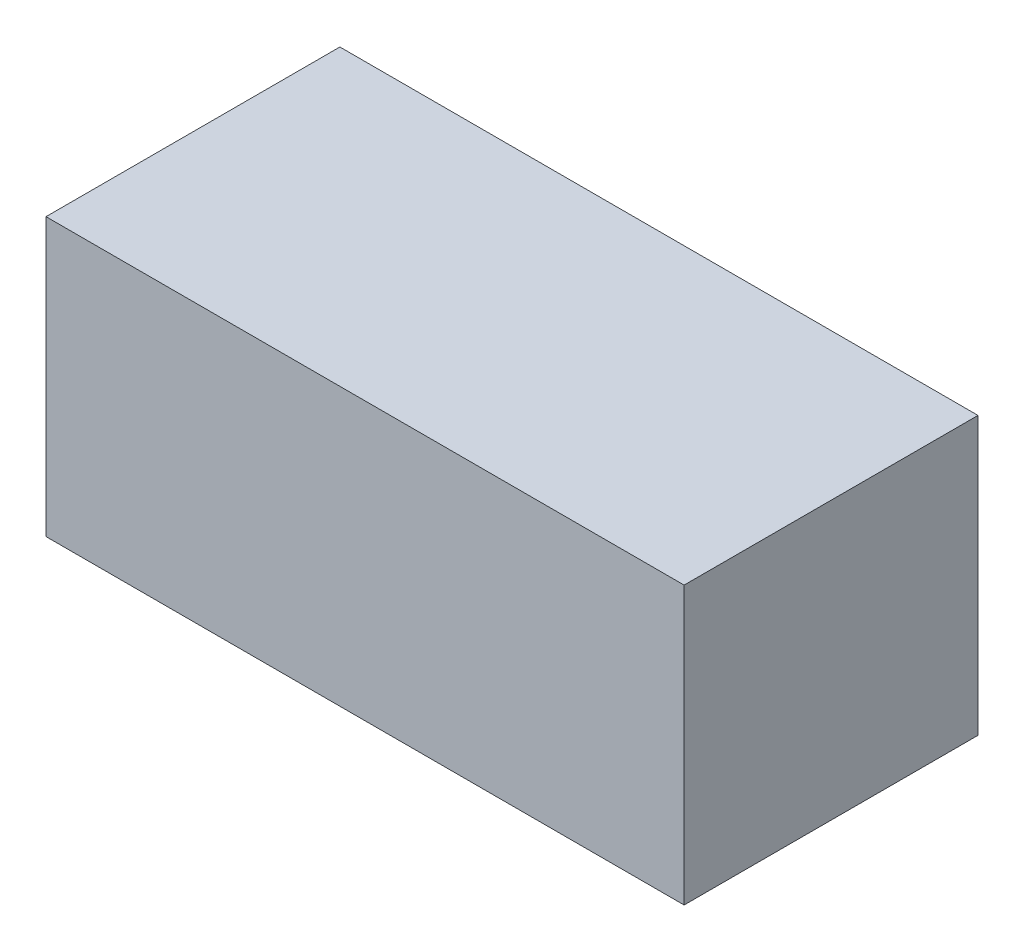
ISO-10303-21;
HEADER;
FILE_DESCRIPTION(('STEP AP214'),'2;1');
FILE_NAME('part.step','',(''),(''),'','','');
FILE_SCHEMA(('AUTOMOTIVE_DESIGN { 1 0 10303 214 1 1 1 1 }'));
ENDSEC;
DATA;
#1=APPLICATION_CONTEXT('core data for automotive mechanical design processes');
#2=APPLICATION_PROTOCOL_DEFINITION('international standard','automotive_design',2000,#1);
#3=PRODUCT_CONTEXT('',#1,'mechanical');
#4=PRODUCT('Part','Part','',(#3));
#5=PRODUCT_RELATED_PRODUCT_CATEGORY('part','',(#4));
#6=PRODUCT_DEFINITION_FORMATION('','',#4);
#7=PRODUCT_DEFINITION_CONTEXT('part definition',#1,'design');
#8=PRODUCT_DEFINITION('design','',#6,#7);
#9=PRODUCT_DEFINITION_SHAPE('','',#8);
#10=(LENGTH_UNIT() NAMED_UNIT(*) SI_UNIT(.MILLI.,.METRE.));
#11=(NAMED_UNIT(*) PLANE_ANGLE_UNIT() SI_UNIT($,.RADIAN.));
#12=(NAMED_UNIT(*) SI_UNIT($,.STERADIAN.) SOLID_ANGLE_UNIT());
#13=UNCERTAINTY_MEASURE_WITH_UNIT(LENGTH_MEASURE(1.E-05),#10,'distance_accuracy_value','');
#14=(GEOMETRIC_REPRESENTATION_CONTEXT(3) GLOBAL_UNCERTAINTY_ASSIGNED_CONTEXT((#13)) GLOBAL_UNIT_ASSIGNED_CONTEXT((#10,
#11,#12)) REPRESENTATION_CONTEXT('',''));
#15=CARTESIAN_POINT('',(0.,0.,0.));
#16=DIRECTION('',(0.,0.,1.));
#17=DIRECTION('',(1.,0.,0.));
#18=AXIS2_PLACEMENT_3D('',#15,#16,#17);
#19=CARTESIAN_POINT('',(38.,33.,17.5));
#20=DIRECTION('',(-1.,0.,0.));
#21=DIRECTION('',(0.,0.,1.));
#22=AXIS2_PLACEMENT_3D('',#19,#20,#21);
#23=PLANE('',#22);
#24=DIRECTION('',(0.,0.,-1.));
#25=VECTOR('',#24,1.);
#26=CARTESIAN_POINT('',(38.,0.,17.5));
#27=LINE('',#26,#25);
#28=CARTESIAN_POINT('',(38.,0.,17.5));
#29=VERTEX_POINT('',#28);
#30=CARTESIAN_POINT('',(38.,0.,-17.5));
#31=VERTEX_POINT('',#30);
#32=EDGE_CURVE('E113',#29,#31,#27,.T.);
#33=ORIENTED_EDGE('',*,*,#32,.T.);
#34=DIRECTION('',(0.,-1.,0.));
#35=VECTOR('',#34,1.);
#36=CARTESIAN_POINT('',(38.,33.,-17.5));
#37=LINE('',#36,#35);
#38=CARTESIAN_POINT('',(38.,33.,-17.5));
#39=VERTEX_POINT('',#38);
#40=EDGE_CURVE('E11',#39,#31,#37,.T.);
#41=ORIENTED_EDGE('',*,*,#40,.F.);
#42=DIRECTION('',(0.,0.,-1.));
#43=VECTOR('',#42,1.);
#44=CARTESIAN_POINT('',(38.,33.,17.5));
#45=LINE('',#44,#43);
#46=CARTESIAN_POINT('',(38.,33.,17.5));
#47=VERTEX_POINT('',#46);
#48=EDGE_CURVE('E97',#47,#39,#45,.T.);
#49=ORIENTED_EDGE('',*,*,#48,.F.);
#50=DIRECTION('',(0.,-1.,0.));
#51=VECTOR('',#50,1.);
#52=CARTESIAN_POINT('',(38.,33.,17.5));
#53=LINE('',#52,#51);
#54=EDGE_CURVE('E109',#47,#29,#53,.T.);
#55=ORIENTED_EDGE('',*,*,#54,.T.);
#56=EDGE_LOOP('',(#33,#41,#49,#55));
#57=FACE_BOUND('',#56,.T.);
#58=ADVANCED_FACE('F45',(#57),#23,.F.);
#59=CARTESIAN_POINT('',(-38.,33.,-17.5));
#60=DIRECTION('',(0.,0.,1.));
#61=DIRECTION('',(1.,0.,0.));
#62=AXIS2_PLACEMENT_3D('',#59,#60,#61);
#63=PLANE('',#62);
#64=DIRECTION('',(-1.,0.,0.));
#65=VECTOR('',#64,1.);
#66=CARTESIAN_POINT('',(-38.,0.,-17.5));
#67=LINE('',#66,#65);
#68=CARTESIAN_POINT('',(-38.,0.,-17.5));
#69=VERTEX_POINT('',#68);
#70=EDGE_CURVE('E102',#31,#69,#67,.T.);
#71=ORIENTED_EDGE('',*,*,#70,.T.);
#72=DIRECTION('',(0.,-1.,0.));
#73=VECTOR('',#72,1.);
#74=CARTESIAN_POINT('',(-38.,33.,-17.5));
#75=LINE('',#74,#73);
#76=CARTESIAN_POINT('',(-38.,33.,-17.5));
#77=VERTEX_POINT('',#76);
#78=EDGE_CURVE('E54',#77,#69,#75,.T.);
#79=ORIENTED_EDGE('',*,*,#78,.F.);
#80=DIRECTION('',(-1.,0.,0.));
#81=VECTOR('',#80,1.);
#82=CARTESIAN_POINT('',(-38.,33.,-17.5));
#83=LINE('',#82,#81);
#84=EDGE_CURVE('E92',#39,#77,#83,.T.);
#85=ORIENTED_EDGE('',*,*,#84,.F.);
#86=ORIENTED_EDGE('',*,*,#40,.T.);
#87=EDGE_LOOP('',(#71,#79,#85,#86));
#88=FACE_BOUND('',#87,.T.);
#89=ADVANCED_FACE('F101',(#88),#63,.F.);
#90=CARTESIAN_POINT('',(-38.,33.,17.5));
#91=DIRECTION('',(1.,0.,0.));
#92=DIRECTION('',(0.,0.,-1.));
#93=AXIS2_PLACEMENT_3D('',#90,#91,#92);
#94=PLANE('',#93);
#95=DIRECTION('',(0.,0.,1.));
#96=VECTOR('',#95,1.);
#97=CARTESIAN_POINT('',(-38.,0.,17.5));
#98=LINE('',#97,#96);
#99=CARTESIAN_POINT('',(-38.,0.,17.5));
#100=VERTEX_POINT('',#99);
#101=EDGE_CURVE('E79',#69,#100,#98,.T.);
#102=ORIENTED_EDGE('',*,*,#101,.T.);
#103=DIRECTION('',(0.,-1.,0.));
#104=VECTOR('',#103,1.);
#105=CARTESIAN_POINT('',(-38.,33.,17.5));
#106=LINE('',#105,#104);
#107=CARTESIAN_POINT('',(-38.,33.,17.5));
#108=VERTEX_POINT('',#107);
#109=EDGE_CURVE('E104',#108,#100,#106,.T.);
#110=ORIENTED_EDGE('',*,*,#109,.F.);
#111=DIRECTION('',(0.,0.,1.));
#112=VECTOR('',#111,1.);
#113=CARTESIAN_POINT('',(-38.,33.,17.5));
#114=LINE('',#113,#112);
#115=EDGE_CURVE('E95',#77,#108,#114,.T.);
#116=ORIENTED_EDGE('',*,*,#115,.F.);
#117=ORIENTED_EDGE('',*,*,#78,.T.);
#118=EDGE_LOOP('',(#102,#110,#116,#117));
#119=FACE_BOUND('',#118,.T.);
#120=ADVANCED_FACE('F105',(#119),#94,.F.);
#121=CARTESIAN_POINT('',(-38.,33.,17.5));
#122=DIRECTION('',(0.,0.,-1.));
#123=DIRECTION('',(-1.,0.,0.));
#124=AXIS2_PLACEMENT_3D('',#121,#122,#123);
#125=PLANE('',#124);
#126=DIRECTION('',(1.,0.,0.));
#127=VECTOR('',#126,1.);
#128=CARTESIAN_POINT('',(-38.,0.,17.5));
#129=LINE('',#128,#127);
#130=EDGE_CURVE('E85',#100,#29,#129,.T.);
#131=ORIENTED_EDGE('',*,*,#130,.T.);
#132=ORIENTED_EDGE('',*,*,#54,.F.);
#133=DIRECTION('',(1.,0.,0.));
#134=VECTOR('',#133,1.);
#135=CARTESIAN_POINT('',(-38.,33.,17.5));
#136=LINE('',#135,#134);
#137=EDGE_CURVE('E62',#108,#47,#136,.T.);
#138=ORIENTED_EDGE('',*,*,#137,.F.);
#139=ORIENTED_EDGE('',*,*,#109,.T.);
#140=EDGE_LOOP('',(#131,#132,#138,#139));
#141=FACE_BOUND('',#140,.T.);
#142=ADVANCED_FACE('F126',(#141),#125,.F.);
#143=CARTESIAN_POINT('',(0.,33.,0.));
#144=DIRECTION('',(0.,-1.,0.));
#145=DIRECTION('',(0.,0.,-1.));
#146=AXIS2_PLACEMENT_3D('',#143,#144,#145);
#147=PLANE('',#146);
#148=ORIENTED_EDGE('',*,*,#48,.T.);
#149=ORIENTED_EDGE('',*,*,#84,.T.);
#150=ORIENTED_EDGE('',*,*,#115,.T.);
#151=ORIENTED_EDGE('',*,*,#137,.T.);
#152=EDGE_LOOP('',(#148,#149,#150,#151));
#153=FACE_BOUND('',#152,.T.);
#154=ADVANCED_FACE('F93',(#153),#147,.F.);
#155=CARTESIAN_POINT('',(0.,0.,0.));
#156=DIRECTION('',(0.,-1.,0.));
#157=DIRECTION('',(0.,0.,-1.));
#158=AXIS2_PLACEMENT_3D('',#155,#156,#157);
#159=PLANE('',#158);
#160=ORIENTED_EDGE('',*,*,#32,.F.);
#161=ORIENTED_EDGE('',*,*,#130,.F.);
#162=ORIENTED_EDGE('',*,*,#101,.F.);
#163=ORIENTED_EDGE('',*,*,#70,.F.);
#164=EDGE_LOOP('',(#160,#161,#162,#163));
#165=FACE_BOUND('',#164,.T.);
#166=ADVANCED_FACE('F129',(#165),#159,.T.);
#167=CLOSED_SHELL('',(#58,#89,#120,#142,#154,#166));
#168=MANIFOLD_SOLID_BREP('B2',#167);
#169=ADVANCED_BREP_SHAPE_REPRESENTATION('',(#18,#168),#14);
#170=SHAPE_DEFINITION_REPRESENTATION(#9,#169);
ENDSEC;
END-ISO-10303-21;
